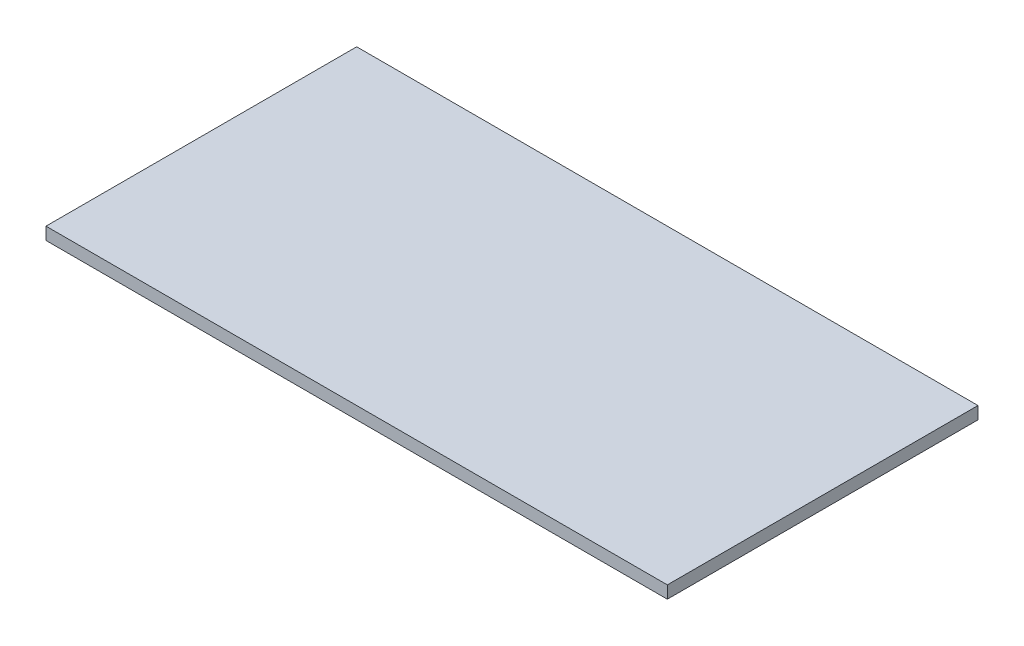
ISO-10303-21;
HEADER;
FILE_DESCRIPTION(('STEP AP214'),'2;1');
FILE_NAME('part.step','',(''),(''),'','','');
FILE_SCHEMA(('AUTOMOTIVE_DESIGN { 1 0 10303 214 1 1 1 1 }'));
ENDSEC;
DATA;
#1=APPLICATION_CONTEXT('core data for automotive mechanical design processes');
#2=APPLICATION_PROTOCOL_DEFINITION('international standard','automotive_design',2000,#1);
#3=PRODUCT_CONTEXT('',#1,'mechanical');
#4=PRODUCT('Part','Part','',(#3));
#5=PRODUCT_RELATED_PRODUCT_CATEGORY('part','',(#4));
#6=PRODUCT_DEFINITION_FORMATION('','',#4);
#7=PRODUCT_DEFINITION_CONTEXT('part definition',#1,'design');
#8=PRODUCT_DEFINITION('design','',#6,#7);
#9=PRODUCT_DEFINITION_SHAPE('','',#8);
#10=(LENGTH_UNIT() NAMED_UNIT(*) SI_UNIT(.MILLI.,.METRE.));
#11=(NAMED_UNIT(*) PLANE_ANGLE_UNIT() SI_UNIT($,.RADIAN.));
#12=(NAMED_UNIT(*) SI_UNIT($,.STERADIAN.) SOLID_ANGLE_UNIT());
#13=UNCERTAINTY_MEASURE_WITH_UNIT(LENGTH_MEASURE(1.E-05),#10,'distance_accuracy_value','');
#14=(GEOMETRIC_REPRESENTATION_CONTEXT(3) GLOBAL_UNCERTAINTY_ASSIGNED_CONTEXT((#13)) GLOBAL_UNIT_ASSIGNED_CONTEXT((#10,
#11,#12)) REPRESENTATION_CONTEXT('',''));
#15=CARTESIAN_POINT('',(0.,0.,0.));
#16=DIRECTION('',(0.,0.,1.));
#17=DIRECTION('',(1.,0.,0.));
#18=AXIS2_PLACEMENT_3D('',#15,#16,#17);
#19=CARTESIAN_POINT('',(-40.,1.6,20.));
#20=DIRECTION('',(1.,0.,0.));
#21=DIRECTION('',(0.,0.,-1.));
#22=AXIS2_PLACEMENT_3D('',#19,#20,#21);
#23=PLANE('',#22);
#24=DIRECTION('',(0.,0.,1.));
#25=VECTOR('',#24,1.);
#26=CARTESIAN_POINT('',(-40.,0.,20.));
#27=LINE('',#26,#25);
#28=CARTESIAN_POINT('',(-40.,0.,-20.));
#29=VERTEX_POINT('',#28);
#30=CARTESIAN_POINT('',(-40.,0.,20.));
#31=VERTEX_POINT('',#30);
#32=EDGE_CURVE('E113',#29,#31,#27,.T.);
#33=ORIENTED_EDGE('',*,*,#32,.T.);
#34=DIRECTION('',(0.,-1.,0.));
#35=VECTOR('',#34,1.);
#36=CARTESIAN_POINT('',(-40.,1.6,20.));
#37=LINE('',#36,#35);
#38=CARTESIAN_POINT('',(-40.,1.6,20.));
#39=VERTEX_POINT('',#38);
#40=EDGE_CURVE('E11',#39,#31,#37,.T.);
#41=ORIENTED_EDGE('',*,*,#40,.F.);
#42=DIRECTION('',(0.,0.,1.));
#43=VECTOR('',#42,1.);
#44=CARTESIAN_POINT('',(-40.,1.6,20.));
#45=LINE('',#44,#43);
#46=CARTESIAN_POINT('',(-40.,1.6,-20.));
#47=VERTEX_POINT('',#46);
#48=EDGE_CURVE('E97',#47,#39,#45,.T.);
#49=ORIENTED_EDGE('',*,*,#48,.F.);
#50=DIRECTION('',(0.,-1.,0.));
#51=VECTOR('',#50,1.);
#52=CARTESIAN_POINT('',(-40.,1.6,-20.));
#53=LINE('',#52,#51);
#54=EDGE_CURVE('E109',#47,#29,#53,.T.);
#55=ORIENTED_EDGE('',*,*,#54,.T.);
#56=EDGE_LOOP('',(#33,#41,#49,#55));
#57=FACE_BOUND('',#56,.T.);
#58=ADVANCED_FACE('F45',(#57),#23,.F.);
#59=CARTESIAN_POINT('',(40.,1.6,20.));
#60=DIRECTION('',(0.,0.,-1.));
#61=DIRECTION('',(-1.,0.,0.));
#62=AXIS2_PLACEMENT_3D('',#59,#60,#61);
#63=PLANE('',#62);
#64=DIRECTION('',(1.,0.,0.));
#65=VECTOR('',#64,1.);
#66=CARTESIAN_POINT('',(40.,0.,20.));
#67=LINE('',#66,#65);
#68=CARTESIAN_POINT('',(40.,0.,20.));
#69=VERTEX_POINT('',#68);
#70=EDGE_CURVE('E102',#31,#69,#67,.T.);
#71=ORIENTED_EDGE('',*,*,#70,.T.);
#72=DIRECTION('',(0.,-1.,0.));
#73=VECTOR('',#72,1.);
#74=CARTESIAN_POINT('',(40.,1.6,20.));
#75=LINE('',#74,#73);
#76=CARTESIAN_POINT('',(40.,1.6,20.));
#77=VERTEX_POINT('',#76);
#78=EDGE_CURVE('E54',#77,#69,#75,.T.);
#79=ORIENTED_EDGE('',*,*,#78,.F.);
#80=DIRECTION('',(1.,0.,0.));
#81=VECTOR('',#80,1.);
#82=CARTESIAN_POINT('',(40.,1.6,20.));
#83=LINE('',#82,#81);
#84=EDGE_CURVE('E92',#39,#77,#83,.T.);
#85=ORIENTED_EDGE('',*,*,#84,.F.);
#86=ORIENTED_EDGE('',*,*,#40,.T.);
#87=EDGE_LOOP('',(#71,#79,#85,#86));
#88=FACE_BOUND('',#87,.T.);
#89=ADVANCED_FACE('F101',(#88),#63,.F.);
#90=CARTESIAN_POINT('',(40.,1.6,20.));
#91=DIRECTION('',(-1.,0.,0.));
#92=DIRECTION('',(0.,0.,1.));
#93=AXIS2_PLACEMENT_3D('',#90,#91,#92);
#94=PLANE('',#93);
#95=DIRECTION('',(0.,0.,-1.));
#96=VECTOR('',#95,1.);
#97=CARTESIAN_POINT('',(40.,0.,20.));
#98=LINE('',#97,#96);
#99=CARTESIAN_POINT('',(40.,0.,-20.));
#100=VERTEX_POINT('',#99);
#101=EDGE_CURVE('E79',#69,#100,#98,.T.);
#102=ORIENTED_EDGE('',*,*,#101,.T.);
#103=DIRECTION('',(0.,-1.,0.));
#104=VECTOR('',#103,1.);
#105=CARTESIAN_POINT('',(40.,1.6,-20.));
#106=LINE('',#105,#104);
#107=CARTESIAN_POINT('',(40.,1.6,-20.));
#108=VERTEX_POINT('',#107);
#109=EDGE_CURVE('E104',#108,#100,#106,.T.);
#110=ORIENTED_EDGE('',*,*,#109,.F.);
#111=DIRECTION('',(0.,0.,-1.));
#112=VECTOR('',#111,1.);
#113=CARTESIAN_POINT('',(40.,1.6,20.));
#114=LINE('',#113,#112);
#115=EDGE_CURVE('E95',#77,#108,#114,.T.);
#116=ORIENTED_EDGE('',*,*,#115,.F.);
#117=ORIENTED_EDGE('',*,*,#78,.T.);
#118=EDGE_LOOP('',(#102,#110,#116,#117));
#119=FACE_BOUND('',#118,.T.);
#120=ADVANCED_FACE('F105',(#119),#94,.F.);
#121=CARTESIAN_POINT('',(40.,1.6,-20.));
#122=DIRECTION('',(0.,0.,1.));
#123=DIRECTION('',(1.,0.,0.));
#124=AXIS2_PLACEMENT_3D('',#121,#122,#123);
#125=PLANE('',#124);
#126=DIRECTION('',(-1.,0.,0.));
#127=VECTOR('',#126,1.);
#128=CARTESIAN_POINT('',(40.,0.,-20.));
#129=LINE('',#128,#127);
#130=EDGE_CURVE('E85',#100,#29,#129,.T.);
#131=ORIENTED_EDGE('',*,*,#130,.T.);
#132=ORIENTED_EDGE('',*,*,#54,.F.);
#133=DIRECTION('',(-1.,0.,0.));
#134=VECTOR('',#133,1.);
#135=CARTESIAN_POINT('',(40.,1.6,-20.));
#136=LINE('',#135,#134);
#137=EDGE_CURVE('E62',#108,#47,#136,.T.);
#138=ORIENTED_EDGE('',*,*,#137,.F.);
#139=ORIENTED_EDGE('',*,*,#109,.T.);
#140=EDGE_LOOP('',(#131,#132,#138,#139));
#141=FACE_BOUND('',#140,.T.);
#142=ADVANCED_FACE('F126',(#141),#125,.F.);
#143=CARTESIAN_POINT('',(0.,1.6,0.));
#144=DIRECTION('',(0.,1.,0.));
#145=DIRECTION('',(0.,0.,1.));
#146=AXIS2_PLACEMENT_3D('',#143,#144,#145);
#147=PLANE('',#146);
#148=ORIENTED_EDGE('',*,*,#48,.T.);
#149=ORIENTED_EDGE('',*,*,#84,.T.);
#150=ORIENTED_EDGE('',*,*,#115,.T.);
#151=ORIENTED_EDGE('',*,*,#137,.T.);
#152=EDGE_LOOP('',(#148,#149,#150,#151));
#153=FACE_BOUND('',#152,.T.);
#154=ADVANCED_FACE('F93',(#153),#147,.T.);
#155=CARTESIAN_POINT('',(0.,0.,0.));
#156=DIRECTION('',(0.,1.,0.));
#157=DIRECTION('',(0.,0.,1.));
#158=AXIS2_PLACEMENT_3D('',#155,#156,#157);
#159=PLANE('',#158);
#160=ORIENTED_EDGE('',*,*,#32,.F.);
#161=ORIENTED_EDGE('',*,*,#130,.F.);
#162=ORIENTED_EDGE('',*,*,#101,.F.);
#163=ORIENTED_EDGE('',*,*,#70,.F.);
#164=EDGE_LOOP('',(#160,#161,#162,#163));
#165=FACE_BOUND('',#164,.T.);
#166=ADVANCED_FACE('F129',(#165),#159,.F.);
#167=CLOSED_SHELL('',(#58,#89,#120,#142,#154,#166));
#168=MANIFOLD_SOLID_BREP('B2',#167);
#169=ADVANCED_BREP_SHAPE_REPRESENTATION('',(#18,#168),#14);
#170=SHAPE_DEFINITION_REPRESENTATION(#9,#169);
ENDSEC;
END-ISO-10303-21;
